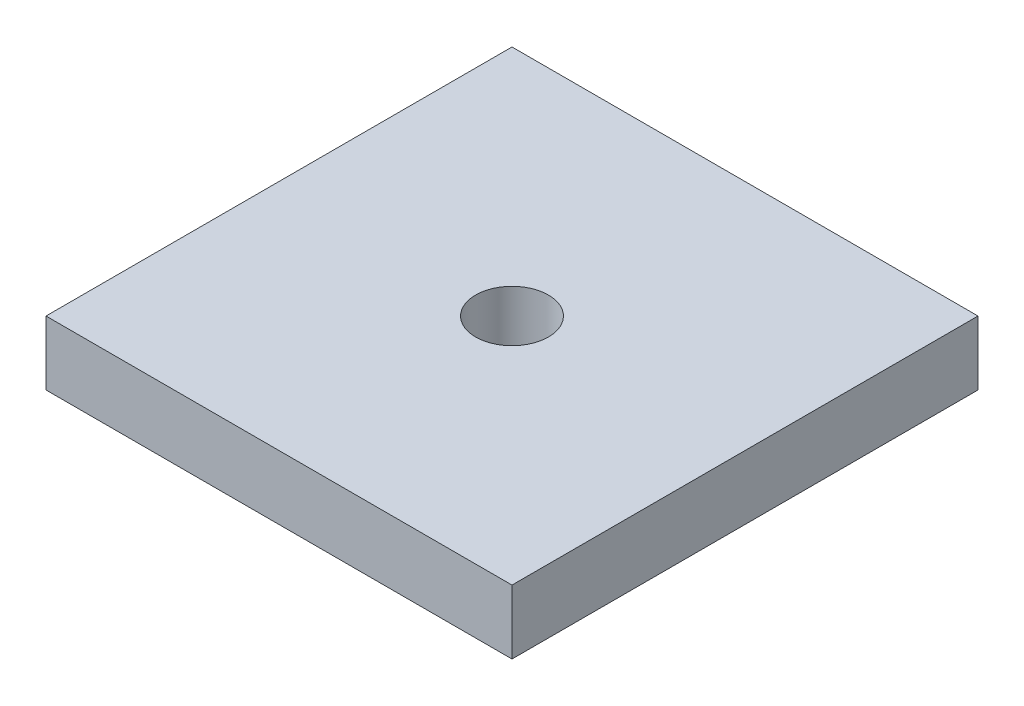
ISO-10303-21;
HEADER;
FILE_DESCRIPTION(('STEP AP214'),'2;1');
FILE_NAME('part.step','',(''),(''),'','','');
FILE_SCHEMA(('AUTOMOTIVE_DESIGN { 1 0 10303 214 1 1 1 1 }'));
ENDSEC;
DATA;
#1=APPLICATION_CONTEXT('core data for automotive mechanical design processes');
#2=APPLICATION_PROTOCOL_DEFINITION('international standard','automotive_design',2000,#1);
#3=PRODUCT_CONTEXT('',#1,'mechanical');
#4=PRODUCT('Part','Part','',(#3));
#5=PRODUCT_RELATED_PRODUCT_CATEGORY('part','',(#4));
#6=PRODUCT_DEFINITION_FORMATION('','',#4);
#7=PRODUCT_DEFINITION_CONTEXT('part definition',#1,'design');
#8=PRODUCT_DEFINITION('design','',#6,#7);
#9=PRODUCT_DEFINITION_SHAPE('','',#8);
#10=(LENGTH_UNIT() NAMED_UNIT(*) SI_UNIT(.MILLI.,.METRE.));
#11=(NAMED_UNIT(*) PLANE_ANGLE_UNIT() SI_UNIT($,.RADIAN.));
#12=(NAMED_UNIT(*) SI_UNIT($,.STERADIAN.) SOLID_ANGLE_UNIT());
#13=UNCERTAINTY_MEASURE_WITH_UNIT(LENGTH_MEASURE(1.E-05),#10,'distance_accuracy_value','');
#14=(GEOMETRIC_REPRESENTATION_CONTEXT(3) GLOBAL_UNCERTAINTY_ASSIGNED_CONTEXT((#13)) GLOBAL_UNIT_ASSIGNED_CONTEXT((#10,
#11,#12)) REPRESENTATION_CONTEXT('',''));
#15=CARTESIAN_POINT('',(0.,0.,0.));
#16=DIRECTION('',(0.,0.,1.));
#17=DIRECTION('',(1.,0.,0.));
#18=AXIS2_PLACEMENT_3D('',#15,#16,#17);
#19=CARTESIAN_POINT('',(0.,2.2,0.));
#20=DIRECTION('',(0.,-1.,0.));
#21=DIRECTION('',(0.,0.,-1.));
#22=AXIS2_PLACEMENT_3D('',#19,#20,#21);
#23=PLANE('',#22);
#24=DIRECTION('',(0.,0.,1.));
#25=VECTOR('',#24,1.);
#26=CARTESIAN_POINT('',(0.,2.2,0.));
#27=LINE('',#26,#25);
#28=CARTESIAN_POINT('',(0.,2.2,-16.));
#29=VERTEX_POINT('',#28);
#30=CARTESIAN_POINT('',(0.,2.2,0.));
#31=VERTEX_POINT('',#30);
#32=EDGE_CURVE('E85',#29,#31,#27,.T.);
#33=ORIENTED_EDGE('',*,*,#32,.T.);
#34=DIRECTION('',(1.,0.,0.));
#35=VECTOR('',#34,1.);
#36=CARTESIAN_POINT('',(0.,2.2,0.));
#37=LINE('',#36,#35);
#38=CARTESIAN_POINT('',(16.,2.2,0.));
#39=VERTEX_POINT('',#38);
#40=EDGE_CURVE('E80',#31,#39,#37,.T.);
#41=ORIENTED_EDGE('',*,*,#40,.T.);
#42=DIRECTION('',(0.,0.,-1.));
#43=VECTOR('',#42,1.);
#44=CARTESIAN_POINT('',(16.,2.2,0.));
#45=LINE('',#44,#43);
#46=CARTESIAN_POINT('',(16.,2.2,-16.));
#47=VERTEX_POINT('',#46);
#48=EDGE_CURVE('E83',#39,#47,#45,.T.);
#49=ORIENTED_EDGE('',*,*,#48,.T.);
#50=DIRECTION('',(-1.,0.,0.));
#51=VECTOR('',#50,1.);
#52=CARTESIAN_POINT('',(0.,2.2,-16.));
#53=LINE('',#52,#51);
#54=EDGE_CURVE('E50',#47,#29,#53,.T.);
#55=ORIENTED_EDGE('',*,*,#54,.T.);
#56=EDGE_LOOP('',(#33,#41,#49,#55));
#57=FACE_BOUND('',#56,.T.);
#58=CARTESIAN_POINT('',(8.,2.2,-8.));
#59=DIRECTION('',(0.,1.,0.));
#60=DIRECTION('',(0.,0.,1.));
#61=AXIS2_PLACEMENT_3D('',#58,#59,#60);
#62=CIRCLE('',#61,1.25);
#63=CARTESIAN_POINT('',(8.,2.2,-6.75));
#64=VERTEX_POINT('',#63);
#65=EDGE_CURVE('E100',#64,#64,#62,.T.);
#66=ORIENTED_EDGE('',*,*,#65,.F.);
#67=EDGE_LOOP('',(#66));
#68=FACE_BOUND('',#67,.T.);
#69=ADVANCED_FACE('F33',(#57,#68),#23,.F.);
#70=CARTESIAN_POINT('',(0.,0.,0.));
#71=DIRECTION('',(0.,-1.,0.));
#72=DIRECTION('',(0.,0.,-1.));
#73=AXIS2_PLACEMENT_3D('',#70,#71,#72);
#74=PLANE('',#73);
#75=DIRECTION('',(0.,0.,1.));
#76=VECTOR('',#75,1.);
#77=CARTESIAN_POINT('',(0.,0.,0.));
#78=LINE('',#77,#76);
#79=CARTESIAN_POINT('',(0.,0.,-16.));
#80=VERTEX_POINT('',#79);
#81=CARTESIAN_POINT('',(0.,0.,0.));
#82=VERTEX_POINT('',#81);
#83=EDGE_CURVE('E97',#80,#82,#78,.T.);
#84=ORIENTED_EDGE('',*,*,#83,.F.);
#85=DIRECTION('',(-1.,0.,0.));
#86=VECTOR('',#85,1.);
#87=CARTESIAN_POINT('',(0.,0.,-16.));
#88=LINE('',#87,#86);
#89=CARTESIAN_POINT('',(16.,0.,-16.));
#90=VERTEX_POINT('',#89);
#91=EDGE_CURVE('E73',#90,#80,#88,.T.);
#92=ORIENTED_EDGE('',*,*,#91,.F.);
#93=DIRECTION('',(0.,0.,-1.));
#94=VECTOR('',#93,1.);
#95=CARTESIAN_POINT('',(16.,0.,0.));
#96=LINE('',#95,#94);
#97=CARTESIAN_POINT('',(16.,0.,0.));
#98=VERTEX_POINT('',#97);
#99=EDGE_CURVE('E67',#98,#90,#96,.T.);
#100=ORIENTED_EDGE('',*,*,#99,.F.);
#101=DIRECTION('',(1.,0.,0.));
#102=VECTOR('',#101,1.);
#103=CARTESIAN_POINT('',(0.,0.,0.));
#104=LINE('',#103,#102);
#105=EDGE_CURVE('E89',#82,#98,#104,.T.);
#106=ORIENTED_EDGE('',*,*,#105,.F.);
#107=EDGE_LOOP('',(#84,#92,#100,#106));
#108=FACE_BOUND('',#107,.T.);
#109=CARTESIAN_POINT('',(8.,0.,-8.));
#110=DIRECTION('',(0.,1.,0.));
#111=DIRECTION('',(0.,0.,1.));
#112=AXIS2_PLACEMENT_3D('',#109,#110,#111);
#113=CIRCLE('',#112,1.25);
#114=CARTESIAN_POINT('',(8.,0.,-6.75));
#115=VERTEX_POINT('',#114);
#116=EDGE_CURVE('E112',#115,#115,#113,.T.);
#117=ORIENTED_EDGE('',*,*,#116,.T.);
#118=EDGE_LOOP('',(#117));
#119=FACE_BOUND('',#118,.T.);
#120=ADVANCED_FACE('F108',(#108,#119),#74,.T.);
#121=CARTESIAN_POINT('',(0.,2.2,0.));
#122=DIRECTION('',(1.,0.,0.));
#123=DIRECTION('',(0.,0.,-1.));
#124=AXIS2_PLACEMENT_3D('',#121,#122,#123);
#125=PLANE('',#124);
#126=ORIENTED_EDGE('',*,*,#83,.T.);
#127=DIRECTION('',(0.,-1.,0.));
#128=VECTOR('',#127,1.);
#129=CARTESIAN_POINT('',(0.,2.2,0.));
#130=LINE('',#129,#128);
#131=EDGE_CURVE('E11',#31,#82,#130,.T.);
#132=ORIENTED_EDGE('',*,*,#131,.F.);
#133=ORIENTED_EDGE('',*,*,#32,.F.);
#134=DIRECTION('',(0.,-1.,0.));
#135=VECTOR('',#134,1.);
#136=CARTESIAN_POINT('',(0.,2.2,-16.));
#137=LINE('',#136,#135);
#138=EDGE_CURVE('E93',#29,#80,#137,.T.);
#139=ORIENTED_EDGE('',*,*,#138,.T.);
#140=EDGE_LOOP('',(#126,#132,#133,#139));
#141=FACE_BOUND('',#140,.T.);
#142=ADVANCED_FACE('F35',(#141),#125,.F.);
#143=CARTESIAN_POINT('',(0.,2.2,0.));
#144=DIRECTION('',(0.,0.,-1.));
#145=DIRECTION('',(-1.,0.,0.));
#146=AXIS2_PLACEMENT_3D('',#143,#144,#145);
#147=PLANE('',#146);
#148=ORIENTED_EDGE('',*,*,#105,.T.);
#149=DIRECTION('',(0.,-1.,0.));
#150=VECTOR('',#149,1.);
#151=CARTESIAN_POINT('',(16.,2.2,0.));
#152=LINE('',#151,#150);
#153=EDGE_CURVE('E42',#39,#98,#152,.T.);
#154=ORIENTED_EDGE('',*,*,#153,.F.);
#155=ORIENTED_EDGE('',*,*,#40,.F.);
#156=ORIENTED_EDGE('',*,*,#131,.T.);
#157=EDGE_LOOP('',(#148,#154,#155,#156));
#158=FACE_BOUND('',#157,.T.);
#159=ADVANCED_FACE('F88',(#158),#147,.F.);
#160=CARTESIAN_POINT('',(16.,2.2,0.));
#161=DIRECTION('',(-1.,0.,0.));
#162=DIRECTION('',(0.,0.,1.));
#163=AXIS2_PLACEMENT_3D('',#160,#161,#162);
#164=PLANE('',#163);
#165=ORIENTED_EDGE('',*,*,#99,.T.);
#166=DIRECTION('',(0.,-1.,0.));
#167=VECTOR('',#166,1.);
#168=CARTESIAN_POINT('',(16.,2.2,-16.));
#169=LINE('',#168,#167);
#170=EDGE_CURVE('E90',#47,#90,#169,.T.);
#171=ORIENTED_EDGE('',*,*,#170,.F.);
#172=ORIENTED_EDGE('',*,*,#48,.F.);
#173=ORIENTED_EDGE('',*,*,#153,.T.);
#174=EDGE_LOOP('',(#165,#171,#172,#173));
#175=FACE_BOUND('',#174,.T.);
#176=ADVANCED_FACE('F91',(#175),#164,.F.);
#177=CARTESIAN_POINT('',(0.,2.2,-16.));
#178=DIRECTION('',(0.,0.,1.));
#179=DIRECTION('',(1.,0.,0.));
#180=AXIS2_PLACEMENT_3D('',#177,#178,#179);
#181=PLANE('',#180);
#182=ORIENTED_EDGE('',*,*,#91,.T.);
#183=ORIENTED_EDGE('',*,*,#138,.F.);
#184=ORIENTED_EDGE('',*,*,#54,.F.);
#185=ORIENTED_EDGE('',*,*,#170,.T.);
#186=EDGE_LOOP('',(#182,#183,#184,#185));
#187=FACE_BOUND('',#186,.T.);
#188=ADVANCED_FACE('F105',(#187),#181,.F.);
#189=CARTESIAN_POINT('',(8.,2.2,-8.));
#190=DIRECTION('',(0.,-1.,0.));
#191=DIRECTION('',(0.,0.,-1.));
#192=AXIS2_PLACEMENT_3D('',#189,#190,#191);
#193=CYLINDRICAL_SURFACE('',#192,1.25);
#194=ORIENTED_EDGE('',*,*,#65,.T.);
#195=EDGE_LOOP('',(#194));
#196=FACE_BOUND('',#195,.T.);
#197=ORIENTED_EDGE('',*,*,#116,.F.);
#198=EDGE_LOOP('',(#197));
#199=FACE_BOUND('',#198,.T.);
#200=ADVANCED_FACE('F118',(#196,#199),#193,.F.);
#201=CLOSED_SHELL('',(#69,#120,#142,#159,#176,#188,#200));
#202=MANIFOLD_SOLID_BREP('B2',#201);
#203=ADVANCED_BREP_SHAPE_REPRESENTATION('',(#18,#202),#14);
#204=SHAPE_DEFINITION_REPRESENTATION(#9,#203);
ENDSEC;
END-ISO-10303-21;
